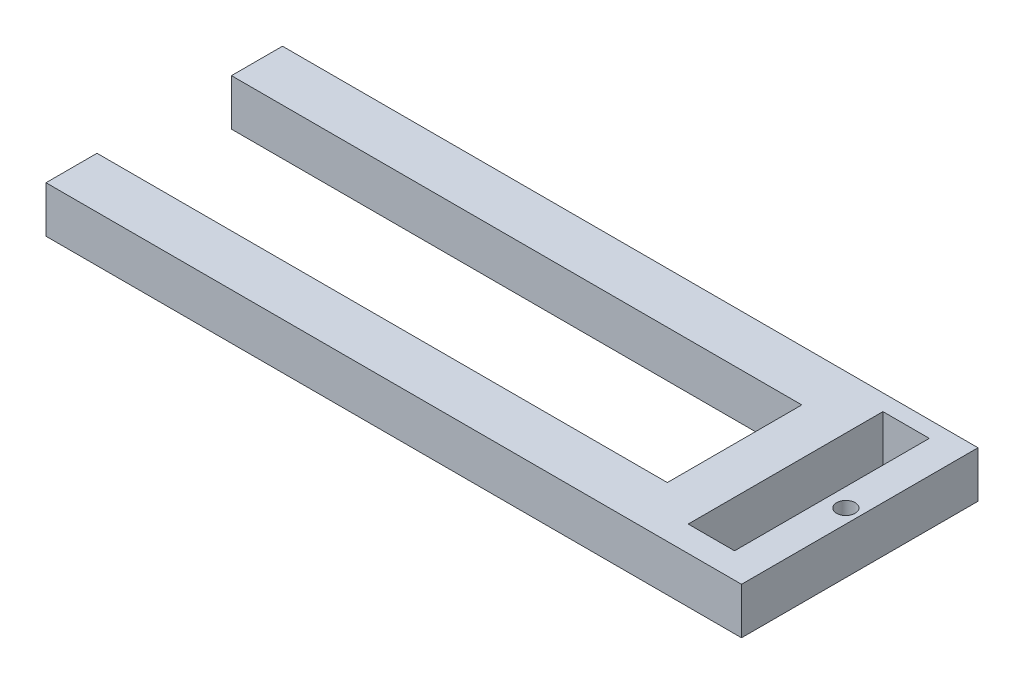
ISO-10303-21;
HEADER;
FILE_DESCRIPTION(('STEP AP214'),'2;1');
FILE_NAME('part.step','',(''),(''),'','','');
FILE_SCHEMA(('AUTOMOTIVE_DESIGN { 1 0 10303 214 1 1 1 1 }'));
ENDSEC;
DATA;
#1=APPLICATION_CONTEXT('core data for automotive mechanical design processes');
#2=APPLICATION_PROTOCOL_DEFINITION('international standard','automotive_design',2000,#1);
#3=PRODUCT_CONTEXT('',#1,'mechanical');
#4=PRODUCT('Part','Part','',(#3));
#5=PRODUCT_RELATED_PRODUCT_CATEGORY('part','',(#4));
#6=PRODUCT_DEFINITION_FORMATION('','',#4);
#7=PRODUCT_DEFINITION_CONTEXT('part definition',#1,'design');
#8=PRODUCT_DEFINITION('design','',#6,#7);
#9=PRODUCT_DEFINITION_SHAPE('','',#8);
#10=(LENGTH_UNIT() NAMED_UNIT(*) SI_UNIT(.MILLI.,.METRE.));
#11=(NAMED_UNIT(*) PLANE_ANGLE_UNIT() SI_UNIT($,.RADIAN.));
#12=(NAMED_UNIT(*) SI_UNIT($,.STERADIAN.) SOLID_ANGLE_UNIT());
#13=UNCERTAINTY_MEASURE_WITH_UNIT(LENGTH_MEASURE(1.E-05),#10,'distance_accuracy_value','');
#14=(GEOMETRIC_REPRESENTATION_CONTEXT(3) GLOBAL_UNCERTAINTY_ASSIGNED_CONTEXT((#13)) GLOBAL_UNIT_ASSIGNED_CONTEXT((#10,
#11,#12)) REPRESENTATION_CONTEXT('',''));
#15=CARTESIAN_POINT('',(0.,0.,0.));
#16=DIRECTION('',(0.,0.,1.));
#17=DIRECTION('',(1.,0.,0.));
#18=AXIS2_PLACEMENT_3D('',#15,#16,#17);
#19=CARTESIAN_POINT('',(-75.,10.,25.5));
#20=DIRECTION('',(1.,0.,0.));
#21=DIRECTION('',(0.,0.,-1.));
#22=AXIS2_PLACEMENT_3D('',#19,#20,#21);
#23=PLANE('',#22);
#24=DIRECTION('',(0.,0.,1.));
#25=VECTOR('',#24,1.);
#26=CARTESIAN_POINT('',(-75.,0.,25.5));
#27=LINE('',#26,#25);
#28=CARTESIAN_POINT('',(-75.,0.,-25.5));
#29=VERTEX_POINT('',#28);
#30=CARTESIAN_POINT('',(-75.,0.,-14.5));
#31=VERTEX_POINT('',#30);
#32=EDGE_CURVE('E151',#29,#31,#27,.T.);
#33=ORIENTED_EDGE('',*,*,#32,.T.);
#34=DIRECTION('',(0.,1.,0.));
#35=VECTOR('',#34,1.);
#36=CARTESIAN_POINT('',(-75.,0.,-14.5));
#37=LINE('',#36,#35);
#38=CARTESIAN_POINT('',(-75.,10.,-14.5));
#39=VERTEX_POINT('',#38);
#40=EDGE_CURVE('E187',#31,#39,#37,.T.);
#41=ORIENTED_EDGE('',*,*,#40,.T.);
#42=DIRECTION('',(0.,0.,1.));
#43=VECTOR('',#42,1.);
#44=CARTESIAN_POINT('',(-75.,10.,25.5));
#45=LINE('',#44,#43);
#46=CARTESIAN_POINT('',(-75.,10.,-25.5));
#47=VERTEX_POINT('',#46);
#48=EDGE_CURVE('E173',#47,#39,#45,.T.);
#49=ORIENTED_EDGE('',*,*,#48,.F.);
#50=DIRECTION('',(0.,-1.,0.));
#51=VECTOR('',#50,1.);
#52=CARTESIAN_POINT('',(-75.,10.,-25.5));
#53=LINE('',#52,#51);
#54=EDGE_CURVE('E45',#47,#29,#53,.T.);
#55=ORIENTED_EDGE('',*,*,#54,.T.);
#56=EDGE_LOOP('',(#33,#41,#49,#55));
#57=FACE_BOUND('',#56,.T.);
#58=ADVANCED_FACE('F37',(#57),#23,.F.);
#59=CARTESIAN_POINT('',(75.,10.,25.5));
#60=DIRECTION('',(-1.,0.,0.));
#61=DIRECTION('',(0.,0.,1.));
#62=AXIS2_PLACEMENT_3D('',#59,#60,#61);
#63=PLANE('',#62);
#64=DIRECTION('',(0.,0.,-1.));
#65=VECTOR('',#64,1.);
#66=CARTESIAN_POINT('',(75.,0.,25.5));
#67=LINE('',#66,#65);
#68=CARTESIAN_POINT('',(75.,0.,25.5));
#69=VERTEX_POINT('',#68);
#70=CARTESIAN_POINT('',(75.,0.,-25.5));
#71=VERTEX_POINT('',#70);
#72=EDGE_CURVE('E155',#69,#71,#67,.T.);
#73=ORIENTED_EDGE('',*,*,#72,.T.);
#74=DIRECTION('',(0.,-1.,0.));
#75=VECTOR('',#74,1.);
#76=CARTESIAN_POINT('',(75.,10.,-25.5));
#77=LINE('',#76,#75);
#78=CARTESIAN_POINT('',(75.,10.,-25.5));
#79=VERTEX_POINT('',#78);
#80=EDGE_CURVE('E11',#79,#71,#77,.T.);
#81=ORIENTED_EDGE('',*,*,#80,.F.);
#82=DIRECTION('',(0.,0.,-1.));
#83=VECTOR('',#82,1.);
#84=CARTESIAN_POINT('',(75.,10.,25.5));
#85=LINE('',#84,#83);
#86=CARTESIAN_POINT('',(75.,10.,25.5));
#87=VERTEX_POINT('',#86);
#88=EDGE_CURVE('E160',#87,#79,#85,.T.);
#89=ORIENTED_EDGE('',*,*,#88,.F.);
#90=DIRECTION('',(0.,-1.,0.));
#91=VECTOR('',#90,1.);
#92=CARTESIAN_POINT('',(75.,10.,25.5));
#93=LINE('',#92,#91);
#94=EDGE_CURVE('E161',#87,#69,#93,.T.);
#95=ORIENTED_EDGE('',*,*,#94,.T.);
#96=EDGE_LOOP('',(#73,#81,#89,#95));
#97=FACE_BOUND('',#96,.T.);
#98=ADVANCED_FACE('F39',(#97),#63,.F.);
#99=CARTESIAN_POINT('',(-75.,10.,-25.5));
#100=DIRECTION('',(0.,0.,1.));
#101=DIRECTION('',(1.,0.,0.));
#102=AXIS2_PLACEMENT_3D('',#99,#100,#101);
#103=PLANE('',#102);
#104=DIRECTION('',(-1.,0.,0.));
#105=VECTOR('',#104,1.);
#106=CARTESIAN_POINT('',(-75.,0.,-25.5));
#107=LINE('',#106,#105);
#108=EDGE_CURVE('E152',#71,#29,#107,.T.);
#109=ORIENTED_EDGE('',*,*,#108,.T.);
#110=ORIENTED_EDGE('',*,*,#54,.F.);
#111=DIRECTION('',(-1.,0.,0.));
#112=VECTOR('',#111,1.);
#113=CARTESIAN_POINT('',(-75.,10.,-25.5));
#114=LINE('',#113,#112);
#115=EDGE_CURVE('E224',#79,#47,#114,.T.);
#116=ORIENTED_EDGE('',*,*,#115,.F.);
#117=ORIENTED_EDGE('',*,*,#80,.T.);
#118=EDGE_LOOP('',(#109,#110,#116,#117));
#119=FACE_BOUND('',#118,.T.);
#120=ADVANCED_FACE('F241',(#119),#103,.F.);
#121=CARTESIAN_POINT('',(-75.,10.,14.5));
#122=VERTEX_POINT('',#121);
#123=CARTESIAN_POINT('',(-75.,10.,25.5));
#124=VERTEX_POINT('',#123);
#125=EDGE_CURVE('E142',#122,#124,#45,.T.);
#126=ORIENTED_EDGE('',*,*,#125,.F.);
#127=DIRECTION('',(0.,1.,0.));
#128=VECTOR('',#127,1.);
#129=CARTESIAN_POINT('',(-75.,0.,14.5));
#130=LINE('',#129,#128);
#131=CARTESIAN_POINT('',(-75.,0.,14.5));
#132=VERTEX_POINT('',#131);
#133=EDGE_CURVE('E129',#132,#122,#130,.T.);
#134=ORIENTED_EDGE('',*,*,#133,.F.);
#135=CARTESIAN_POINT('',(-75.,0.,25.5));
#136=VERTEX_POINT('',#135);
#137=EDGE_CURVE('E140',#132,#136,#27,.T.);
#138=ORIENTED_EDGE('',*,*,#137,.T.);
#139=DIRECTION('',(0.,-1.,0.));
#140=VECTOR('',#139,1.);
#141=CARTESIAN_POINT('',(-75.,10.,25.5));
#142=LINE('',#141,#140);
#143=EDGE_CURVE('E164',#124,#136,#142,.T.);
#144=ORIENTED_EDGE('',*,*,#143,.F.);
#145=EDGE_LOOP('',(#126,#134,#138,#144));
#146=FACE_BOUND('',#145,.T.);
#147=ADVANCED_FACE('F138',(#146),#23,.F.);
#148=CARTESIAN_POINT('',(-75.,10.,25.5));
#149=DIRECTION('',(0.,0.,-1.));
#150=DIRECTION('',(-1.,0.,0.));
#151=AXIS2_PLACEMENT_3D('',#148,#149,#150);
#152=PLANE('',#151);
#153=DIRECTION('',(1.,0.,0.));
#154=VECTOR('',#153,1.);
#155=CARTESIAN_POINT('',(-75.,0.,25.5));
#156=LINE('',#155,#154);
#157=EDGE_CURVE('E150',#136,#69,#156,.T.);
#158=ORIENTED_EDGE('',*,*,#157,.T.);
#159=ORIENTED_EDGE('',*,*,#94,.F.);
#160=DIRECTION('',(1.,0.,0.));
#161=VECTOR('',#160,1.);
#162=CARTESIAN_POINT('',(-75.,10.,25.5));
#163=LINE('',#162,#161);
#164=EDGE_CURVE('E165',#124,#87,#163,.T.);
#165=ORIENTED_EDGE('',*,*,#164,.F.);
#166=ORIENTED_EDGE('',*,*,#143,.T.);
#167=EDGE_LOOP('',(#158,#159,#165,#166));
#168=FACE_BOUND('',#167,.T.);
#169=ADVANCED_FACE('F234',(#168),#152,.F.);
#170=CARTESIAN_POINT('',(0.,10.,0.));
#171=DIRECTION('',(0.,-1.,0.));
#172=DIRECTION('',(0.,0.,-1.));
#173=AXIS2_PLACEMENT_3D('',#170,#171,#172);
#174=PLANE('',#173);
#175=CARTESIAN_POINT('',(72.,10.,0.));
#176=DIRECTION('',(0.,1.,0.));
#177=DIRECTION('',(0.,0.,1.));
#178=AXIS2_PLACEMENT_3D('',#175,#176,#177);
#179=CIRCLE('',#178,2.);
#180=CARTESIAN_POINT('',(72.,10.,2.));
#181=VERTEX_POINT('',#180);
#182=EDGE_CURVE('E291',#181,#181,#179,.T.);
#183=ORIENTED_EDGE('',*,*,#182,.F.);
#184=EDGE_LOOP('',(#183));
#185=FACE_BOUND('',#184,.T.);
#186=DIRECTION('',(-1.,0.,0.));
#187=VECTOR('',#186,1.);
#188=CARTESIAN_POINT('',(58.,10.,-22.));
#189=LINE('',#188,#187);
#190=CARTESIAN_POINT('',(68.,10.,-22.));
#191=VERTEX_POINT('',#190);
#192=CARTESIAN_POINT('',(58.,10.,-22.));
#193=VERTEX_POINT('',#192);
#194=EDGE_CURVE('E207',#191,#193,#189,.T.);
#195=ORIENTED_EDGE('',*,*,#194,.F.);
#196=DIRECTION('',(0.,0.,-1.));
#197=VECTOR('',#196,1.);
#198=CARTESIAN_POINT('',(68.,10.,20.));
#199=LINE('',#198,#197);
#200=CARTESIAN_POINT('',(68.,10.,20.));
#201=VERTEX_POINT('',#200);
#202=EDGE_CURVE('E60',#201,#191,#199,.T.);
#203=ORIENTED_EDGE('',*,*,#202,.F.);
#204=DIRECTION('',(1.,0.,0.));
#205=VECTOR('',#204,1.);
#206=CARTESIAN_POINT('',(58.,10.,20.));
#207=LINE('',#206,#205);
#208=CARTESIAN_POINT('',(58.,10.,20.));
#209=VERTEX_POINT('',#208);
#210=EDGE_CURVE('E196',#209,#201,#207,.T.);
#211=ORIENTED_EDGE('',*,*,#210,.F.);
#212=DIRECTION('',(0.,0.,1.));
#213=VECTOR('',#212,1.);
#214=CARTESIAN_POINT('',(58.,10.,20.));
#215=LINE('',#214,#213);
#216=EDGE_CURVE('E210',#193,#209,#215,.T.);
#217=ORIENTED_EDGE('',*,*,#216,.F.);
#218=EDGE_LOOP('',(#195,#203,#211,#217));
#219=FACE_BOUND('',#218,.T.);
#220=ORIENTED_EDGE('',*,*,#48,.T.);
#221=DIRECTION('',(-1.,0.,0.));
#222=VECTOR('',#221,1.);
#223=CARTESIAN_POINT('',(-75.,10.,-14.5));
#224=LINE('',#223,#222);
#225=CARTESIAN_POINT('',(48.,10.,-14.5));
#226=VERTEX_POINT('',#225);
#227=EDGE_CURVE('E134',#226,#39,#224,.T.);
#228=ORIENTED_EDGE('',*,*,#227,.F.);
#229=DIRECTION('',(0.,0.,-1.));
#230=VECTOR('',#229,1.);
#231=CARTESIAN_POINT('',(48.,10.,14.5));
#232=LINE('',#231,#230);
#233=CARTESIAN_POINT('',(48.,10.,14.5));
#234=VERTEX_POINT('',#233);
#235=EDGE_CURVE('E182',#234,#226,#232,.T.);
#236=ORIENTED_EDGE('',*,*,#235,.F.);
#237=DIRECTION('',(1.,0.,0.));
#238=VECTOR('',#237,1.);
#239=CARTESIAN_POINT('',(-75.,10.,14.5));
#240=LINE('',#239,#238);
#241=EDGE_CURVE('E180',#122,#234,#240,.T.);
#242=ORIENTED_EDGE('',*,*,#241,.F.);
#243=ORIENTED_EDGE('',*,*,#125,.T.);
#244=ORIENTED_EDGE('',*,*,#164,.T.);
#245=ORIENTED_EDGE('',*,*,#88,.T.);
#246=ORIENTED_EDGE('',*,*,#115,.T.);
#247=EDGE_LOOP('',(#220,#228,#236,#242,#243,#244,#245,#246));
#248=FACE_BOUND('',#247,.T.);
#249=ADVANCED_FACE('F236',(#185,#219,#248),#174,.F.);
#250=CARTESIAN_POINT('',(0.,0.,0.));
#251=DIRECTION('',(0.,-1.,0.));
#252=DIRECTION('',(0.,0.,-1.));
#253=AXIS2_PLACEMENT_3D('',#250,#251,#252);
#254=PLANE('',#253);
#255=CARTESIAN_POINT('',(72.,0.,0.));
#256=DIRECTION('',(0.,1.,0.));
#257=DIRECTION('',(0.,0.,1.));
#258=AXIS2_PLACEMENT_3D('',#255,#256,#257);
#259=CIRCLE('',#258,2.);
#260=CARTESIAN_POINT('',(72.,0.,2.));
#261=VERTEX_POINT('',#260);
#262=EDGE_CURVE('E183',#261,#261,#259,.T.);
#263=ORIENTED_EDGE('',*,*,#262,.T.);
#264=EDGE_LOOP('',(#263));
#265=FACE_BOUND('',#264,.T.);
#266=DIRECTION('',(-1.,0.,0.));
#267=VECTOR('',#266,1.);
#268=CARTESIAN_POINT('',(-75.,0.,-14.5));
#269=LINE('',#268,#267);
#270=CARTESIAN_POINT('',(48.,0.,-14.5));
#271=VERTEX_POINT('',#270);
#272=EDGE_CURVE('E143',#271,#31,#269,.T.);
#273=ORIENTED_EDGE('',*,*,#272,.T.);
#274=ORIENTED_EDGE('',*,*,#32,.F.);
#275=ORIENTED_EDGE('',*,*,#108,.F.);
#276=ORIENTED_EDGE('',*,*,#72,.F.);
#277=ORIENTED_EDGE('',*,*,#157,.F.);
#278=ORIENTED_EDGE('',*,*,#137,.F.);
#279=DIRECTION('',(1.,0.,0.));
#280=VECTOR('',#279,1.);
#281=CARTESIAN_POINT('',(-75.,0.,14.5));
#282=LINE('',#281,#280);
#283=CARTESIAN_POINT('',(48.,0.,14.5));
#284=VERTEX_POINT('',#283);
#285=EDGE_CURVE('E125',#132,#284,#282,.T.);
#286=ORIENTED_EDGE('',*,*,#285,.T.);
#287=DIRECTION('',(0.,0.,-1.));
#288=VECTOR('',#287,1.);
#289=CARTESIAN_POINT('',(48.,0.,14.5));
#290=LINE('',#289,#288);
#291=EDGE_CURVE('E52',#284,#271,#290,.T.);
#292=ORIENTED_EDGE('',*,*,#291,.T.);
#293=EDGE_LOOP('',(#273,#274,#275,#276,#277,#278,#286,#292));
#294=FACE_BOUND('',#293,.T.);
#295=DIRECTION('',(0.,0.,-1.));
#296=VECTOR('',#295,1.);
#297=CARTESIAN_POINT('',(68.,0.,20.));
#298=LINE('',#297,#296);
#299=CARTESIAN_POINT('',(68.,0.,20.));
#300=VERTEX_POINT('',#299);
#301=CARTESIAN_POINT('',(68.,0.,-22.));
#302=VERTEX_POINT('',#301);
#303=EDGE_CURVE('E192',#300,#302,#298,.T.);
#304=ORIENTED_EDGE('',*,*,#303,.T.);
#305=DIRECTION('',(-1.,0.,0.));
#306=VECTOR('',#305,1.);
#307=CARTESIAN_POINT('',(58.,0.,-22.));
#308=LINE('',#307,#306);
#309=CARTESIAN_POINT('',(58.,0.,-22.));
#310=VERTEX_POINT('',#309);
#311=EDGE_CURVE('E195',#302,#310,#308,.T.);
#312=ORIENTED_EDGE('',*,*,#311,.T.);
#313=DIRECTION('',(0.,0.,1.));
#314=VECTOR('',#313,1.);
#315=CARTESIAN_POINT('',(58.,0.,20.));
#316=LINE('',#315,#314);
#317=CARTESIAN_POINT('',(58.,0.,20.));
#318=VERTEX_POINT('',#317);
#319=EDGE_CURVE('E199',#310,#318,#316,.T.);
#320=ORIENTED_EDGE('',*,*,#319,.T.);
#321=DIRECTION('',(1.,0.,0.));
#322=VECTOR('',#321,1.);
#323=CARTESIAN_POINT('',(58.,0.,20.));
#324=LINE('',#323,#322);
#325=EDGE_CURVE('E202',#318,#300,#324,.T.);
#326=ORIENTED_EDGE('',*,*,#325,.T.);
#327=EDGE_LOOP('',(#304,#312,#320,#326));
#328=FACE_BOUND('',#327,.T.);
#329=ADVANCED_FACE('F147',(#265,#294,#328),#254,.T.);
#330=CARTESIAN_POINT('',(68.,0.,20.));
#331=DIRECTION('',(1.,0.,0.));
#332=DIRECTION('',(0.,0.,-1.));
#333=AXIS2_PLACEMENT_3D('',#330,#331,#332);
#334=PLANE('',#333);
#335=ORIENTED_EDGE('',*,*,#202,.T.);
#336=DIRECTION('',(0.,1.,0.));
#337=VECTOR('',#336,1.);
#338=CARTESIAN_POINT('',(68.,0.,-22.));
#339=LINE('',#338,#337);
#340=EDGE_CURVE('E205',#302,#191,#339,.T.);
#341=ORIENTED_EDGE('',*,*,#340,.F.);
#342=ORIENTED_EDGE('',*,*,#303,.F.);
#343=DIRECTION('',(0.,1.,0.));
#344=VECTOR('',#343,1.);
#345=CARTESIAN_POINT('',(68.,0.,20.));
#346=LINE('',#345,#344);
#347=EDGE_CURVE('E215',#300,#201,#346,.T.);
#348=ORIENTED_EDGE('',*,*,#347,.T.);
#349=EDGE_LOOP('',(#335,#341,#342,#348));
#350=FACE_BOUND('',#349,.T.);
#351=ADVANCED_FACE('F256',(#350),#334,.F.);
#352=CARTESIAN_POINT('',(58.,0.,20.));
#353=DIRECTION('',(0.,0.,1.));
#354=DIRECTION('',(1.,0.,0.));
#355=AXIS2_PLACEMENT_3D('',#352,#353,#354);
#356=PLANE('',#355);
#357=ORIENTED_EDGE('',*,*,#210,.T.);
#358=ORIENTED_EDGE('',*,*,#347,.F.);
#359=ORIENTED_EDGE('',*,*,#325,.F.);
#360=DIRECTION('',(0.,1.,0.));
#361=VECTOR('',#360,1.);
#362=CARTESIAN_POINT('',(58.,0.,20.));
#363=LINE('',#362,#361);
#364=EDGE_CURVE('E217',#318,#209,#363,.T.);
#365=ORIENTED_EDGE('',*,*,#364,.T.);
#366=EDGE_LOOP('',(#357,#358,#359,#365));
#367=FACE_BOUND('',#366,.T.);
#368=ADVANCED_FACE('F263',(#367),#356,.F.);
#369=CARTESIAN_POINT('',(58.,0.,20.));
#370=DIRECTION('',(-1.,0.,0.));
#371=DIRECTION('',(0.,0.,1.));
#372=AXIS2_PLACEMENT_3D('',#369,#370,#371);
#373=PLANE('',#372);
#374=ORIENTED_EDGE('',*,*,#216,.T.);
#375=ORIENTED_EDGE('',*,*,#364,.F.);
#376=ORIENTED_EDGE('',*,*,#319,.F.);
#377=DIRECTION('',(0.,1.,0.));
#378=VECTOR('',#377,1.);
#379=CARTESIAN_POINT('',(58.,0.,-22.));
#380=LINE('',#379,#378);
#381=EDGE_CURVE('E219',#310,#193,#380,.T.);
#382=ORIENTED_EDGE('',*,*,#381,.T.);
#383=EDGE_LOOP('',(#374,#375,#376,#382));
#384=FACE_BOUND('',#383,.T.);
#385=ADVANCED_FACE('F267',(#384),#373,.F.);
#386=CARTESIAN_POINT('',(58.,0.,-22.));
#387=DIRECTION('',(0.,0.,-1.));
#388=DIRECTION('',(-1.,0.,0.));
#389=AXIS2_PLACEMENT_3D('',#386,#387,#388);
#390=PLANE('',#389);
#391=ORIENTED_EDGE('',*,*,#194,.T.);
#392=ORIENTED_EDGE('',*,*,#381,.F.);
#393=ORIENTED_EDGE('',*,*,#311,.F.);
#394=ORIENTED_EDGE('',*,*,#340,.T.);
#395=EDGE_LOOP('',(#391,#392,#393,#394));
#396=FACE_BOUND('',#395,.T.);
#397=ADVANCED_FACE('F264',(#396),#390,.F.);
#398=CARTESIAN_POINT('',(-75.,0.,-14.5));
#399=DIRECTION('',(0.,0.,-1.));
#400=DIRECTION('',(-1.,0.,0.));
#401=AXIS2_PLACEMENT_3D('',#398,#399,#400);
#402=PLANE('',#401);
#403=ORIENTED_EDGE('',*,*,#227,.T.);
#404=ORIENTED_EDGE('',*,*,#40,.F.);
#405=ORIENTED_EDGE('',*,*,#272,.F.);
#406=DIRECTION('',(0.,1.,0.));
#407=VECTOR('',#406,1.);
#408=CARTESIAN_POINT('',(48.,0.,-14.5));
#409=LINE('',#408,#407);
#410=EDGE_CURVE('E189',#271,#226,#409,.T.);
#411=ORIENTED_EDGE('',*,*,#410,.T.);
#412=EDGE_LOOP('',(#403,#404,#405,#411));
#413=FACE_BOUND('',#412,.T.);
#414=ADVANCED_FACE('F240',(#413),#402,.F.);
#415=CARTESIAN_POINT('',(48.,0.,14.5));
#416=DIRECTION('',(1.,0.,0.));
#417=DIRECTION('',(0.,0.,-1.));
#418=AXIS2_PLACEMENT_3D('',#415,#416,#417);
#419=PLANE('',#418);
#420=ORIENTED_EDGE('',*,*,#235,.T.);
#421=ORIENTED_EDGE('',*,*,#410,.F.);
#422=ORIENTED_EDGE('',*,*,#291,.F.);
#423=DIRECTION('',(0.,1.,0.));
#424=VECTOR('',#423,1.);
#425=CARTESIAN_POINT('',(48.,0.,14.5));
#426=LINE('',#425,#424);
#427=EDGE_CURVE('E131',#284,#234,#426,.T.);
#428=ORIENTED_EDGE('',*,*,#427,.T.);
#429=EDGE_LOOP('',(#420,#421,#422,#428));
#430=FACE_BOUND('',#429,.T.);
#431=ADVANCED_FACE('F239',(#430),#419,.F.);
#432=CARTESIAN_POINT('',(-75.,0.,14.5));
#433=DIRECTION('',(0.,0.,1.));
#434=DIRECTION('',(1.,0.,0.));
#435=AXIS2_PLACEMENT_3D('',#432,#433,#434);
#436=PLANE('',#435);
#437=ORIENTED_EDGE('',*,*,#241,.T.);
#438=ORIENTED_EDGE('',*,*,#427,.F.);
#439=ORIENTED_EDGE('',*,*,#285,.F.);
#440=ORIENTED_EDGE('',*,*,#133,.T.);
#441=EDGE_LOOP('',(#437,#438,#439,#440));
#442=FACE_BOUND('',#441,.T.);
#443=ADVANCED_FACE('F128',(#442),#436,.F.);
#444=CARTESIAN_POINT('',(72.,0.,0.));
#445=DIRECTION('',(0.,1.,0.));
#446=DIRECTION('',(0.,0.,1.));
#447=AXIS2_PLACEMENT_3D('',#444,#445,#446);
#448=CYLINDRICAL_SURFACE('',#447,2.);
#449=ORIENTED_EDGE('',*,*,#262,.F.);
#450=EDGE_LOOP('',(#449));
#451=FACE_BOUND('',#450,.T.);
#452=ORIENTED_EDGE('',*,*,#182,.T.);
#453=EDGE_LOOP('',(#452));
#454=FACE_BOUND('',#453,.T.);
#455=ADVANCED_FACE('F277',(#451,#454),#448,.F.);
#456=CLOSED_SHELL('',(#58,#98,#120,#147,#169,#249,#329,#351,#368,#385,#397,#414,#431,#443,#455));
#457=MANIFOLD_SOLID_BREP('B2',#456);
#458=ADVANCED_BREP_SHAPE_REPRESENTATION('',(#18,#457),#14);
#459=SHAPE_DEFINITION_REPRESENTATION(#9,#458);
ENDSEC;
END-ISO-10303-21;
